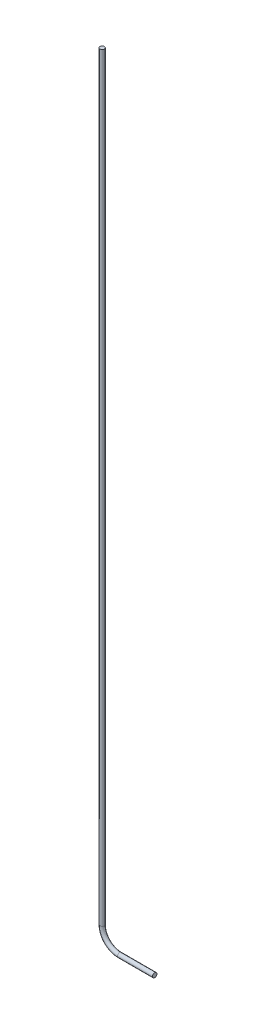
ISO-10303-21;
HEADER;
FILE_DESCRIPTION(('STEP AP214'),'2;1');
FILE_NAME('part.step','',(''),(''),'','','');
FILE_SCHEMA(('AUTOMOTIVE_DESIGN { 1 0 10303 214 1 1 1 1 }'));
ENDSEC;
DATA;
#1=APPLICATION_CONTEXT('core data for automotive mechanical design processes');
#2=APPLICATION_PROTOCOL_DEFINITION('international standard','automotive_design',2000,#1);
#3=PRODUCT_CONTEXT('',#1,'mechanical');
#4=PRODUCT('Part','Part','',(#3));
#5=PRODUCT_RELATED_PRODUCT_CATEGORY('part','',(#4));
#6=PRODUCT_DEFINITION_FORMATION('','',#4);
#7=PRODUCT_DEFINITION_CONTEXT('part definition',#1,'design');
#8=PRODUCT_DEFINITION('design','',#6,#7);
#9=PRODUCT_DEFINITION_SHAPE('','',#8);
#10=(LENGTH_UNIT() NAMED_UNIT(*) SI_UNIT(.MILLI.,.METRE.));
#11=(NAMED_UNIT(*) PLANE_ANGLE_UNIT() SI_UNIT($,.RADIAN.));
#12=(NAMED_UNIT(*) SI_UNIT($,.STERADIAN.) SOLID_ANGLE_UNIT());
#13=UNCERTAINTY_MEASURE_WITH_UNIT(LENGTH_MEASURE(1.E-05),#10,'distance_accuracy_value','');
#14=(GEOMETRIC_REPRESENTATION_CONTEXT(3) GLOBAL_UNCERTAINTY_ASSIGNED_CONTEXT((#13)) GLOBAL_UNIT_ASSIGNED_CONTEXT((#10,
#11,#12)) REPRESENTATION_CONTEXT('',''));
#15=CARTESIAN_POINT('',(0.,0.,0.));
#16=DIRECTION('',(0.,0.,1.));
#17=DIRECTION('',(1.,0.,0.));
#18=AXIS2_PLACEMENT_3D('',#15,#16,#17);
#19=CARTESIAN_POINT('',(152.4,0.,0.));
#20=DIRECTION('',(-1.,0.,0.));
#21=DIRECTION('',(0.,0.,1.));
#22=AXIS2_PLACEMENT_3D('',#19,#20,#21);
#23=PLANE('',#22);
#24=CARTESIAN_POINT('',(152.4,0.,0.));
#25=DIRECTION('',(-1.,0.,0.));
#26=DIRECTION('',(0.,0.,1.));
#27=AXIS2_PLACEMENT_3D('',#24,#25,#26);
#28=CIRCLE('',#27,6.35);
#29=CARTESIAN_POINT('',(152.4,0.,6.35));
#30=VERTEX_POINT('',#29);
#31=EDGE_CURVE('E61',#30,#30,#28,.T.);
#32=ORIENTED_EDGE('',*,*,#31,.F.);
#33=EDGE_LOOP('',(#32));
#34=FACE_BOUND('',#33,.T.);
#35=ADVANCED_FACE('F47',(#34),#23,.F.);
#36=CARTESIAN_POINT('',(0.,2253.996,0.));
#37=DIRECTION('',(0.,1.,0.));
#38=DIRECTION('',(0.,0.,1.));
#39=AXIS2_PLACEMENT_3D('',#36,#37,#38);
#40=PLANE('',#39);
#41=CARTESIAN_POINT('',(0.,2253.996,0.));
#42=DIRECTION('',(0.,1.,0.));
#43=DIRECTION('',(0.,0.,1.));
#44=AXIS2_PLACEMENT_3D('',#41,#42,#43);
#45=CIRCLE('',#44,6.35);
#46=CARTESIAN_POINT('',(0.,2253.996,6.35));
#47=VERTEX_POINT('',#46);
#48=EDGE_CURVE('E11',#47,#47,#45,.T.);
#49=ORIENTED_EDGE('',*,*,#48,.T.);
#50=EDGE_LOOP('',(#49));
#51=FACE_BOUND('',#50,.T.);
#52=ADVANCED_FACE('F70',(#51),#40,.T.);
#53=CARTESIAN_POINT('',(152.4,0.,0.));
#54=DIRECTION('',(-1.,0.,0.));
#55=DIRECTION('',(0.,0.,1.));
#56=AXIS2_PLACEMENT_3D('',#53,#54,#55);
#57=CYLINDRICAL_SURFACE('',#56,6.35);
#58=CARTESIAN_POINT('',(50.8000000000003,0.,0.));
#59=DIRECTION('',(-1.,0.,0.));
#60=DIRECTION('',(0.,0.,1.));
#61=AXIS2_PLACEMENT_3D('',#58,#59,#60);
#62=CIRCLE('',#61,6.35);
#63=CARTESIAN_POINT('',(50.8000000000004,-6.3500000000011,0.));
#64=VERTEX_POINT('',#63);
#65=EDGE_CURVE('E57',#64,#64,#62,.T.);
#66=ORIENTED_EDGE('',*,*,#65,.F.);
#67=EDGE_LOOP('',(#66));
#68=FACE_BOUND('',#67,.T.);
#69=ORIENTED_EDGE('',*,*,#31,.T.);
#70=EDGE_LOOP('',(#69));
#71=FACE_BOUND('',#70,.T.);
#72=ADVANCED_FACE('F67',(#68,#71),#57,.T.);
#73=CARTESIAN_POINT('',(50.8,50.8,0.));
#74=DIRECTION('',(0.,0.,-1.));
#75=DIRECTION('',(-1.,0.,0.));
#76=AXIS2_PLACEMENT_3D('',#73,#74,#75);
#77=TOROIDAL_SURFACE('',#76,50.8000000000011,6.35);
#78=CARTESIAN_POINT('',(0.,50.8,0.));
#79=DIRECTION('',(0.,1.,0.));
#80=DIRECTION('',(0.,0.,1.));
#81=AXIS2_PLACEMENT_3D('',#78,#79,#80);
#82=CIRCLE('',#81,6.35);
#83=CARTESIAN_POINT('',(-6.3500000000011,50.8,0.));
#84=VERTEX_POINT('',#83);
#85=EDGE_CURVE('E53',#84,#84,#82,.T.);
#86=CARTESIAN_POINT('',(50.8,50.8,0.));
#87=DIRECTION('',(0.,0.,-1.));
#88=DIRECTION('',(-1.,0.,0.));
#89=AXIS2_PLACEMENT_3D('',#86,#87,#88);
#90=CIRCLE('',#89,57.1500000000011);
#91=EDGE_CURVE('',#64,#84,#90,.T.);
#92=ORIENTED_EDGE('',*,*,#65,.T.);
#93=ORIENTED_EDGE('',*,*,#85,.F.);
#94=ORIENTED_EDGE('',*,*,#91,.T.);
#95=ORIENTED_EDGE('',*,*,#91,.F.);
#96=EDGE_LOOP('',(#92,#94,#93,#95));
#97=FACE_BOUND('',#96,.T.);
#98=ADVANCED_FACE('F76',(#97),#77,.T.);
#99=CARTESIAN_POINT('',(0.,50.8000000000004,0.));
#100=DIRECTION('',(0.,1.,0.));
#101=DIRECTION('',(0.,0.,1.));
#102=AXIS2_PLACEMENT_3D('',#99,#100,#101);
#103=CYLINDRICAL_SURFACE('',#102,6.35);
#104=ORIENTED_EDGE('',*,*,#48,.F.);
#105=EDGE_LOOP('',(#104));
#106=FACE_BOUND('',#105,.T.);
#107=ORIENTED_EDGE('',*,*,#85,.T.);
#108=EDGE_LOOP('',(#107));
#109=FACE_BOUND('',#108,.T.);
#110=ADVANCED_FACE('F74',(#106,#109),#103,.T.);
#111=CLOSED_SHELL('',(#35,#52,#72,#98,#110));
#112=MANIFOLD_SOLID_BREP('B2',#111);
#113=ADVANCED_BREP_SHAPE_REPRESENTATION('',(#18,#112),#14);
#114=SHAPE_DEFINITION_REPRESENTATION(#9,#113);
ENDSEC;
END-ISO-10303-21;
